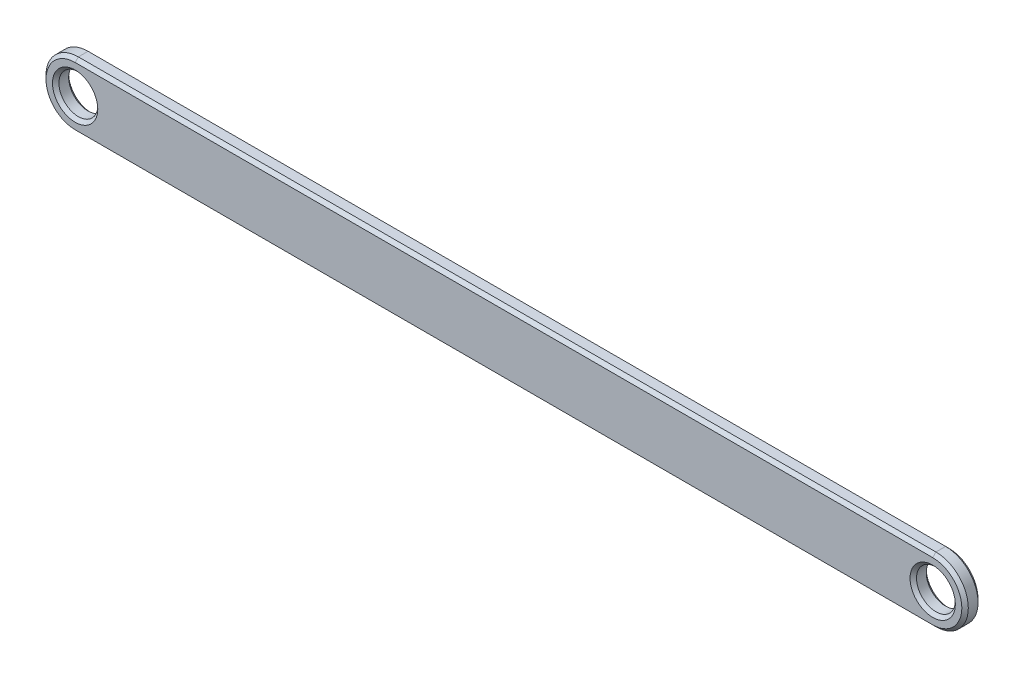
ISO-10303-21;
HEADER;
FILE_DESCRIPTION(('STEP AP214'),'2;1');
FILE_NAME('part.step','',(''),(''),'','','');
FILE_SCHEMA(('AUTOMOTIVE_DESIGN { 1 0 10303 214 1 1 1 1 }'));
ENDSEC;
DATA;
#1=APPLICATION_CONTEXT('core data for automotive mechanical design processes');
#2=APPLICATION_PROTOCOL_DEFINITION('international standard','automotive_design',2000,#1);
#3=PRODUCT_CONTEXT('',#1,'mechanical');
#4=PRODUCT('Part','Part','',(#3));
#5=PRODUCT_RELATED_PRODUCT_CATEGORY('part','',(#4));
#6=PRODUCT_DEFINITION_FORMATION('','',#4);
#7=PRODUCT_DEFINITION_CONTEXT('part definition',#1,'design');
#8=PRODUCT_DEFINITION('design','',#6,#7);
#9=PRODUCT_DEFINITION_SHAPE('','',#8);
#10=(LENGTH_UNIT() NAMED_UNIT(*) SI_UNIT(.MILLI.,.METRE.));
#11=(NAMED_UNIT(*) PLANE_ANGLE_UNIT() SI_UNIT($,.RADIAN.));
#12=(NAMED_UNIT(*) SI_UNIT($,.STERADIAN.) SOLID_ANGLE_UNIT());
#13=UNCERTAINTY_MEASURE_WITH_UNIT(LENGTH_MEASURE(1.E-05),#10,'distance_accuracy_value','');
#14=(GEOMETRIC_REPRESENTATION_CONTEXT(3) GLOBAL_UNCERTAINTY_ASSIGNED_CONTEXT((#13)) GLOBAL_UNIT_ASSIGNED_CONTEXT((#10,
#11,#12)) REPRESENTATION_CONTEXT('',''));
#15=CARTESIAN_POINT('',(0.,0.,0.));
#16=DIRECTION('',(0.,0.,1.));
#17=DIRECTION('',(1.,0.,0.));
#18=AXIS2_PLACEMENT_3D('',#15,#16,#17);
#19=CARTESIAN_POINT('',(-662.5,0.,25.));
#20=DIRECTION('',(0.,0.,1.));
#21=DIRECTION('',(1.,0.,0.));
#22=AXIS2_PLACEMENT_3D('',#19,#20,#21);
#23=PLANE('',#22);
#24=CARTESIAN_POINT('',(662.5,1.62265700887024E-13,25.));
#25=DIRECTION('',(0.,0.,1.));
#26=DIRECTION('',(1.,0.,0.));
#27=AXIS2_PLACEMENT_3D('',#24,#25,#26);
#28=CIRCLE('',#27,35.0000000000001);
#29=CARTESIAN_POINT('',(697.5,1.62265700887024E-13,25.));
#30=VERTEX_POINT('',#29);
#31=EDGE_CURVE('E11',#30,#30,#28,.F.);
#32=ORIENTED_EDGE('',*,*,#31,.T.);
#33=EDGE_LOOP('',(#32));
#34=FACE_BOUND('',#33,.T.);
#35=CARTESIAN_POINT('',(662.5,1.62265700887024E-13,25.));
#36=DIRECTION('',(0.,0.,1.));
#37=DIRECTION('',(1.,0.,0.));
#38=AXIS2_PLACEMENT_3D('',#35,#36,#37);
#39=CIRCLE('',#38,45.0000000000001);
#40=CARTESIAN_POINT('',(662.5,-44.9999999999999,25.));
#41=VERTEX_POINT('',#40);
#42=CARTESIAN_POINT('',(662.5,45.0000000000003,25.));
#43=VERTEX_POINT('',#42);
#44=EDGE_CURVE('E57',#41,#43,#39,.T.);
#45=ORIENTED_EDGE('',*,*,#44,.T.);
#46=DIRECTION('',(-1.,0.,0.));
#47=VECTOR('',#46,1.);
#48=CARTESIAN_POINT('',(-662.5,45.0000000000001,25.));
#49=LINE('',#48,#47);
#50=CARTESIAN_POINT('',(-662.5,45.0000000000001,25.));
#51=VERTEX_POINT('',#50);
#52=EDGE_CURVE('E49',#43,#51,#49,.T.);
#53=ORIENTED_EDGE('',*,*,#52,.T.);
#54=CARTESIAN_POINT('',(-662.5,0.,25.));
#55=DIRECTION('',(0.,0.,1.));
#56=DIRECTION('',(1.,0.,0.));
#57=AXIS2_PLACEMENT_3D('',#54,#55,#56);
#58=CIRCLE('',#57,45.0000000000001);
#59=CARTESIAN_POINT('',(-662.5,-45.0000000000001,25.));
#60=VERTEX_POINT('',#59);
#61=EDGE_CURVE('E194',#51,#60,#58,.T.);
#62=ORIENTED_EDGE('',*,*,#61,.T.);
#63=DIRECTION('',(1.,0.,0.));
#64=VECTOR('',#63,1.);
#65=CARTESIAN_POINT('',(662.5,-44.9999999999999,25.));
#66=LINE('',#65,#64);
#67=EDGE_CURVE('E62',#60,#41,#66,.T.);
#68=ORIENTED_EDGE('',*,*,#67,.T.);
#69=EDGE_LOOP('',(#45,#53,#62,#68));
#70=FACE_BOUND('',#69,.T.);
#71=CARTESIAN_POINT('',(-662.5,0.,25.));
#72=DIRECTION('',(0.,0.,1.));
#73=DIRECTION('',(1.,0.,0.));
#74=AXIS2_PLACEMENT_3D('',#71,#72,#73);
#75=CIRCLE('',#74,35.0000000000001);
#76=CARTESIAN_POINT('',(-627.5,0.,25.));
#77=VERTEX_POINT('',#76);
#78=EDGE_CURVE('E190',#77,#77,#75,.F.);
#79=ORIENTED_EDGE('',*,*,#78,.T.);
#80=EDGE_LOOP('',(#79));
#81=FACE_BOUND('',#80,.T.);
#82=ADVANCED_FACE('F39',(#34,#70,#81),#23,.T.);
#83=CARTESIAN_POINT('',(-662.5,0.,0.));
#84=DIRECTION('',(0.,0.,1.));
#85=DIRECTION('',(1.,0.,0.));
#86=AXIS2_PLACEMENT_3D('',#83,#84,#85);
#87=PLANE('',#86);
#88=CARTESIAN_POINT('',(662.5,1.62265700887024E-13,0.));
#89=DIRECTION('',(0.,0.,1.));
#90=DIRECTION('',(1.,0.,0.));
#91=AXIS2_PLACEMENT_3D('',#88,#89,#90);
#92=CIRCLE('',#91,34.9999999999999);
#93=CARTESIAN_POINT('',(697.5,1.62265700887024E-13,0.));
#94=VERTEX_POINT('',#93);
#95=EDGE_CURVE('E142',#94,#94,#92,.T.);
#96=ORIENTED_EDGE('',*,*,#95,.T.);
#97=EDGE_LOOP('',(#96));
#98=FACE_BOUND('',#97,.T.);
#99=CARTESIAN_POINT('',(-662.5,0.,0.));
#100=DIRECTION('',(0.,0.,1.));
#101=DIRECTION('',(1.,0.,0.));
#102=AXIS2_PLACEMENT_3D('',#99,#100,#101);
#103=CIRCLE('',#102,34.9999999999999);
#104=CARTESIAN_POINT('',(-627.5,0.,0.));
#105=VERTEX_POINT('',#104);
#106=EDGE_CURVE('E137',#105,#105,#103,.T.);
#107=ORIENTED_EDGE('',*,*,#106,.T.);
#108=EDGE_LOOP('',(#107));
#109=FACE_BOUND('',#108,.T.);
#110=CARTESIAN_POINT('',(662.5,1.62265700887024E-13,0.));
#111=DIRECTION('',(0.,0.,1.));
#112=DIRECTION('',(1.,0.,0.));
#113=AXIS2_PLACEMENT_3D('',#110,#111,#112);
#114=CIRCLE('',#113,45.0000000000001);
#115=CARTESIAN_POINT('',(662.5,45.0000000000003,0.));
#116=VERTEX_POINT('',#115);
#117=CARTESIAN_POINT('',(662.5,-45.,0.));
#118=VERTEX_POINT('',#117);
#119=EDGE_CURVE('E135',#116,#118,#114,.F.);
#120=ORIENTED_EDGE('',*,*,#119,.T.);
#121=DIRECTION('',(-1.,0.,0.));
#122=VECTOR('',#121,1.);
#123=CARTESIAN_POINT('',(-662.5,-45.0000000000001,0.));
#124=LINE('',#123,#122);
#125=CARTESIAN_POINT('',(-662.5,-45.0000000000001,0.));
#126=VERTEX_POINT('',#125);
#127=EDGE_CURVE('E112',#118,#126,#124,.T.);
#128=ORIENTED_EDGE('',*,*,#127,.T.);
#129=CARTESIAN_POINT('',(-662.5,0.,0.));
#130=DIRECTION('',(0.,0.,1.));
#131=DIRECTION('',(1.,0.,0.));
#132=AXIS2_PLACEMENT_3D('',#129,#130,#131);
#133=CIRCLE('',#132,45.0000000000001);
#134=CARTESIAN_POINT('',(-662.5,45.0000000000001,0.));
#135=VERTEX_POINT('',#134);
#136=EDGE_CURVE('E123',#126,#135,#133,.F.);
#137=ORIENTED_EDGE('',*,*,#136,.T.);
#138=DIRECTION('',(1.,0.,0.));
#139=VECTOR('',#138,1.);
#140=CARTESIAN_POINT('',(-662.5,45.0000000000001,0.));
#141=LINE('',#140,#139);
#142=EDGE_CURVE('E130',#135,#116,#141,.T.);
#143=ORIENTED_EDGE('',*,*,#142,.T.);
#144=EDGE_LOOP('',(#120,#128,#137,#143));
#145=FACE_BOUND('',#144,.T.);
#146=ADVANCED_FACE('F133',(#98,#109,#145),#87,.F.);
#147=CARTESIAN_POINT('',(-662.5,0.,25.));
#148=DIRECTION('',(0.,0.,-1.));
#149=DIRECTION('',(-1.,0.,0.));
#150=AXIS2_PLACEMENT_3D('',#147,#148,#149);
#151=CYLINDRICAL_SURFACE('',#150,50.);
#152=DIRECTION('',(0.,0.,-1.));
#153=VECTOR('',#152,1.);
#154=CARTESIAN_POINT('',(-662.5,50.,25.));
#155=LINE('',#154,#153);
#156=CARTESIAN_POINT('',(-662.5,50.,20.0000000000003));
#157=VERTEX_POINT('',#156);
#158=CARTESIAN_POINT('',(-662.5,50.,4.9999999999999));
#159=VERTEX_POINT('',#158);
#160=EDGE_CURVE('E210',#157,#159,#155,.T.);
#161=ORIENTED_EDGE('',*,*,#160,.T.);
#162=CARTESIAN_POINT('',(-662.5,0.,4.9999999999999));
#163=DIRECTION('',(0.,0.,1.));
#164=DIRECTION('',(1.,0.,0.));
#165=AXIS2_PLACEMENT_3D('',#162,#163,#164);
#166=CIRCLE('',#165,50.);
#167=CARTESIAN_POINT('',(-662.5,-50.,4.9999999999999));
#168=VERTEX_POINT('',#167);
#169=EDGE_CURVE('E187',#159,#168,#166,.T.);
#170=ORIENTED_EDGE('',*,*,#169,.T.);
#171=DIRECTION('',(0.,0.,-1.));
#172=VECTOR('',#171,1.);
#173=CARTESIAN_POINT('',(-662.5,-50.,25.));
#174=LINE('',#173,#172);
#175=CARTESIAN_POINT('',(-662.5,-50.,20.0000000000003));
#176=VERTEX_POINT('',#175);
#177=EDGE_CURVE('E131',#176,#168,#174,.T.);
#178=ORIENTED_EDGE('',*,*,#177,.F.);
#179=CARTESIAN_POINT('',(-662.5,0.,20.0000000000003));
#180=DIRECTION('',(0.,0.,1.));
#181=DIRECTION('',(1.,0.,0.));
#182=AXIS2_PLACEMENT_3D('',#179,#180,#181);
#183=CIRCLE('',#182,50.);
#184=EDGE_CURVE('E184',#176,#157,#183,.F.);
#185=ORIENTED_EDGE('',*,*,#184,.T.);
#186=EDGE_LOOP('',(#161,#170,#178,#185));
#187=FACE_BOUND('',#186,.T.);
#188=ADVANCED_FACE('F240',(#187),#151,.T.);
#189=CARTESIAN_POINT('',(662.5,-49.9999999999998,25.));
#190=DIRECTION('',(0.,1.,0.));
#191=DIRECTION('',(-1.,0.,0.));
#192=AXIS2_PLACEMENT_3D('',#189,#190,#191);
#193=PLANE('',#192);
#194=ORIENTED_EDGE('',*,*,#177,.T.);
#195=DIRECTION('',(1.,0.,0.));
#196=VECTOR('',#195,1.);
#197=CARTESIAN_POINT('',(662.5,-49.9999999999998,4.9999999999999));
#198=LINE('',#197,#196);
#199=CARTESIAN_POINT('',(662.5,-49.9999999999998,4.9999999999999));
#200=VERTEX_POINT('',#199);
#201=EDGE_CURVE('E115',#168,#200,#198,.T.);
#202=ORIENTED_EDGE('',*,*,#201,.T.);
#203=DIRECTION('',(0.,0.,-1.));
#204=VECTOR('',#203,1.);
#205=CARTESIAN_POINT('',(662.5,-49.9999999999998,25.));
#206=LINE('',#205,#204);
#207=CARTESIAN_POINT('',(662.5,-49.9999999999998,20.0000000000003));
#208=VERTEX_POINT('',#207);
#209=EDGE_CURVE('E237',#208,#200,#206,.T.);
#210=ORIENTED_EDGE('',*,*,#209,.F.);
#211=DIRECTION('',(-1.,0.,0.));
#212=VECTOR('',#211,1.);
#213=CARTESIAN_POINT('',(-662.5,-50.,20.0000000000003));
#214=LINE('',#213,#212);
#215=EDGE_CURVE('E166',#208,#176,#214,.T.);
#216=ORIENTED_EDGE('',*,*,#215,.T.);
#217=EDGE_LOOP('',(#194,#202,#210,#216));
#218=FACE_BOUND('',#217,.T.);
#219=ADVANCED_FACE('F235',(#218),#193,.F.);
#220=CARTESIAN_POINT('',(662.5,1.62265700887024E-13,25.));
#221=DIRECTION('',(0.,0.,-1.));
#222=DIRECTION('',(-1.,0.,0.));
#223=AXIS2_PLACEMENT_3D('',#220,#221,#222);
#224=CYLINDRICAL_SURFACE('',#223,50.);
#225=ORIENTED_EDGE('',*,*,#209,.T.);
#226=CARTESIAN_POINT('',(662.5,1.62265700887024E-13,4.9999999999999));
#227=DIRECTION('',(0.,0.,1.));
#228=DIRECTION('',(1.,0.,0.));
#229=AXIS2_PLACEMENT_3D('',#226,#227,#228);
#230=CIRCLE('',#229,50.);
#231=CARTESIAN_POINT('',(662.5,50.0000000000002,4.9999999999999));
#232=VERTEX_POINT('',#231);
#233=EDGE_CURVE('E174',#200,#232,#230,.T.);
#234=ORIENTED_EDGE('',*,*,#233,.T.);
#235=DIRECTION('',(0.,0.,-1.));
#236=VECTOR('',#235,1.);
#237=CARTESIAN_POINT('',(662.5,50.0000000000002,25.));
#238=LINE('',#237,#236);
#239=CARTESIAN_POINT('',(662.5,50.0000000000002,20.0000000000003));
#240=VERTEX_POINT('',#239);
#241=EDGE_CURVE('E245',#240,#232,#238,.T.);
#242=ORIENTED_EDGE('',*,*,#241,.F.);
#243=CARTESIAN_POINT('',(662.5,1.62265700887024E-13,20.0000000000003));
#244=DIRECTION('',(0.,0.,1.));
#245=DIRECTION('',(1.,0.,0.));
#246=AXIS2_PLACEMENT_3D('',#243,#244,#245);
#247=CIRCLE('',#246,50.);
#248=EDGE_CURVE('E171',#240,#208,#247,.F.);
#249=ORIENTED_EDGE('',*,*,#248,.T.);
#250=EDGE_LOOP('',(#225,#234,#242,#249));
#251=FACE_BOUND('',#250,.T.);
#252=ADVANCED_FACE('F259',(#251),#224,.T.);
#253=CARTESIAN_POINT('',(662.5,50.0000000000002,25.));
#254=DIRECTION('',(0.,-1.,0.));
#255=DIRECTION('',(1.,0.,0.));
#256=AXIS2_PLACEMENT_3D('',#253,#254,#255);
#257=PLANE('',#256);
#258=ORIENTED_EDGE('',*,*,#241,.T.);
#259=DIRECTION('',(-1.,0.,0.));
#260=VECTOR('',#259,1.);
#261=CARTESIAN_POINT('',(662.5,50.0000000000002,4.9999999999999));
#262=LINE('',#261,#260);
#263=EDGE_CURVE('E181',#232,#159,#262,.T.);
#264=ORIENTED_EDGE('',*,*,#263,.T.);
#265=ORIENTED_EDGE('',*,*,#160,.F.);
#266=DIRECTION('',(1.,0.,0.));
#267=VECTOR('',#266,1.);
#268=CARTESIAN_POINT('',(662.5,50.0000000000002,20.0000000000003));
#269=LINE('',#268,#267);
#270=EDGE_CURVE('E177',#157,#240,#269,.T.);
#271=ORIENTED_EDGE('',*,*,#270,.T.);
#272=EDGE_LOOP('',(#258,#264,#265,#271));
#273=FACE_BOUND('',#272,.T.);
#274=ADVANCED_FACE('F265',(#273),#257,.F.);
#275=CARTESIAN_POINT('',(-662.5,0.,25.));
#276=DIRECTION('',(0.,0.,-1.));
#277=DIRECTION('',(-1.,0.,0.));
#278=AXIS2_PLACEMENT_3D('',#275,#276,#277);
#279=CYLINDRICAL_SURFACE('',#278,30.);
#280=CARTESIAN_POINT('',(-662.5,0.,4.99999999999986));
#281=DIRECTION('',(0.,0.,1.));
#282=DIRECTION('',(1.,0.,0.));
#283=AXIS2_PLACEMENT_3D('',#280,#281,#282);
#284=CIRCLE('',#283,30.);
#285=CARTESIAN_POINT('',(-632.5,0.,4.99999999999986));
#286=VERTEX_POINT('',#285);
#287=EDGE_CURVE('E162',#286,#286,#284,.F.);
#288=ORIENTED_EDGE('',*,*,#287,.T.);
#289=EDGE_LOOP('',(#288));
#290=FACE_BOUND('',#289,.T.);
#291=CARTESIAN_POINT('',(-662.5,0.,19.9999999999998));
#292=DIRECTION('',(0.,0.,1.));
#293=DIRECTION('',(1.,0.,0.));
#294=AXIS2_PLACEMENT_3D('',#291,#292,#293);
#295=CIRCLE('',#294,30.);
#296=CARTESIAN_POINT('',(-632.5,0.,19.9999999999998));
#297=VERTEX_POINT('',#296);
#298=EDGE_CURVE('E158',#297,#297,#295,.T.);
#299=ORIENTED_EDGE('',*,*,#298,.T.);
#300=EDGE_LOOP('',(#299));
#301=FACE_BOUND('',#300,.T.);
#302=ADVANCED_FACE('F281',(#290,#301),#279,.F.);
#303=CARTESIAN_POINT('',(662.5,1.62265700887024E-13,25.));
#304=DIRECTION('',(0.,0.,-1.));
#305=DIRECTION('',(-1.,0.,0.));
#306=AXIS2_PLACEMENT_3D('',#303,#304,#305);
#307=CYLINDRICAL_SURFACE('',#306,30.);
#308=CARTESIAN_POINT('',(662.5,1.62265700887024E-13,4.99999999999986));
#309=DIRECTION('',(0.,0.,1.));
#310=DIRECTION('',(1.,0.,0.));
#311=AXIS2_PLACEMENT_3D('',#308,#309,#310);
#312=CIRCLE('',#311,30.);
#313=CARTESIAN_POINT('',(692.5,1.62265700887024E-13,4.99999999999986));
#314=VERTEX_POINT('',#313);
#315=EDGE_CURVE('E154',#314,#314,#312,.F.);
#316=ORIENTED_EDGE('',*,*,#315,.T.);
#317=EDGE_LOOP('',(#316));
#318=FACE_BOUND('',#317,.T.);
#319=CARTESIAN_POINT('',(662.5,1.62265700887024E-13,19.9999999999998));
#320=DIRECTION('',(0.,0.,1.));
#321=DIRECTION('',(1.,0.,0.));
#322=AXIS2_PLACEMENT_3D('',#319,#320,#321);
#323=CIRCLE('',#322,30.);
#324=CARTESIAN_POINT('',(692.5,1.62265700887024E-13,19.9999999999998));
#325=VERTEX_POINT('',#324);
#326=EDGE_CURVE('E150',#325,#325,#323,.T.);
#327=ORIENTED_EDGE('',*,*,#326,.T.);
#328=EDGE_LOOP('',(#327));
#329=FACE_BOUND('',#328,.T.);
#330=ADVANCED_FACE('F283',(#318,#329),#307,.F.);
#331=CARTESIAN_POINT('',(662.5,1.62265700887024E-13,0.));
#332=DIRECTION('',(0.,0.,-1.));
#333=DIRECTION('',(-1.,0.,0.));
#334=AXIS2_PLACEMENT_3D('',#331,#332,#333);
#335=CONICAL_SURFACE('',#334,34.9999999999999,0.785398163397449);
#336=ORIENTED_EDGE('',*,*,#315,.F.);
#337=EDGE_LOOP('',(#336));
#338=FACE_BOUND('',#337,.T.);
#339=ORIENTED_EDGE('',*,*,#95,.F.);
#340=EDGE_LOOP('',(#339));
#341=FACE_BOUND('',#340,.T.);
#342=ADVANCED_FACE('F290',(#338,#341),#335,.F.);
#343=CARTESIAN_POINT('',(-662.5,0.,0.));
#344=DIRECTION('',(0.,0.,-1.));
#345=DIRECTION('',(-1.,0.,0.));
#346=AXIS2_PLACEMENT_3D('',#343,#344,#345);
#347=CONICAL_SURFACE('',#346,34.9999999999999,0.785398163397449);
#348=ORIENTED_EDGE('',*,*,#287,.F.);
#349=EDGE_LOOP('',(#348));
#350=FACE_BOUND('',#349,.T.);
#351=ORIENTED_EDGE('',*,*,#106,.F.);
#352=EDGE_LOOP('',(#351));
#353=FACE_BOUND('',#352,.T.);
#354=ADVANCED_FACE('F306',(#350,#353),#347,.F.);
#355=CARTESIAN_POINT('',(662.5,50.0000000000002,4.9999999999999));
#356=DIRECTION('',(0.,-0.707106781186548,0.707106781186547));
#357=DIRECTION('',(-1.,0.,0.));
#358=AXIS2_PLACEMENT_3D('',#355,#356,#357);
#359=PLANE('',#358);
#360=DIRECTION('',(0.,0.707106781186547,0.707106781186548));
#361=VECTOR('',#360,1.);
#362=CARTESIAN_POINT('',(662.5,45.0000000000003,0.));
#363=LINE('',#362,#361);
#364=EDGE_CURVE('E119',#116,#232,#363,.T.);
#365=ORIENTED_EDGE('',*,*,#364,.F.);
#366=ORIENTED_EDGE('',*,*,#142,.F.);
#367=DIRECTION('',(0.,-0.707106781186547,-0.707106781186548));
#368=VECTOR('',#367,1.);
#369=CARTESIAN_POINT('',(-662.5,50.,4.9999999999999));
#370=LINE('',#369,#368);
#371=EDGE_CURVE('E126',#159,#135,#370,.T.);
#372=ORIENTED_EDGE('',*,*,#371,.F.);
#373=ORIENTED_EDGE('',*,*,#263,.F.);
#374=EDGE_LOOP('',(#365,#366,#372,#373));
#375=FACE_BOUND('',#374,.T.);
#376=ADVANCED_FACE('F252',(#375),#359,.F.);
#377=CARTESIAN_POINT('',(-662.5,0.,4.9999999999999));
#378=DIRECTION('',(0.,0.,1.));
#379=DIRECTION('',(1.,0.,0.));
#380=AXIS2_PLACEMENT_3D('',#377,#378,#379);
#381=CONICAL_SURFACE('',#380,50.,0.785398163397448);
#382=ORIENTED_EDGE('',*,*,#371,.T.);
#383=ORIENTED_EDGE('',*,*,#136,.F.);
#384=DIRECTION('',(0.,0.707106781186547,-0.707106781186548));
#385=VECTOR('',#384,1.);
#386=CARTESIAN_POINT('',(-662.5,-50.,4.9999999999999));
#387=LINE('',#386,#385);
#388=EDGE_CURVE('E108',#168,#126,#387,.T.);
#389=ORIENTED_EDGE('',*,*,#388,.F.);
#390=ORIENTED_EDGE('',*,*,#169,.F.);
#391=EDGE_LOOP('',(#382,#383,#389,#390));
#392=FACE_BOUND('',#391,.T.);
#393=ADVANCED_FACE('F124',(#392),#381,.T.);
#394=CARTESIAN_POINT('',(662.5,1.62265700887024E-13,4.9999999999999));
#395=DIRECTION('',(0.,0.,1.));
#396=DIRECTION('',(1.,0.,0.));
#397=AXIS2_PLACEMENT_3D('',#394,#395,#396);
#398=CONICAL_SURFACE('',#397,50.,0.785398163397448);
#399=ORIENTED_EDGE('',*,*,#364,.T.);
#400=ORIENTED_EDGE('',*,*,#233,.F.);
#401=DIRECTION('',(0.,-0.707106781186547,0.707106781186548));
#402=VECTOR('',#401,1.);
#403=CARTESIAN_POINT('',(662.5,-45.,0.));
#404=LINE('',#403,#402);
#405=EDGE_CURVE('E120',#118,#200,#404,.T.);
#406=ORIENTED_EDGE('',*,*,#405,.F.);
#407=ORIENTED_EDGE('',*,*,#119,.F.);
#408=EDGE_LOOP('',(#399,#400,#406,#407));
#409=FACE_BOUND('',#408,.T.);
#410=ADVANCED_FACE('F255',(#409),#398,.T.);
#411=CARTESIAN_POINT('',(662.5,-49.9999999999998,4.9999999999999));
#412=DIRECTION('',(0.,0.707106781186548,0.707106781186547));
#413=DIRECTION('',(1.,0.,0.));
#414=AXIS2_PLACEMENT_3D('',#411,#412,#413);
#415=PLANE('',#414);
#416=ORIENTED_EDGE('',*,*,#388,.T.);
#417=ORIENTED_EDGE('',*,*,#127,.F.);
#418=ORIENTED_EDGE('',*,*,#405,.T.);
#419=ORIENTED_EDGE('',*,*,#201,.F.);
#420=EDGE_LOOP('',(#416,#417,#418,#419));
#421=FACE_BOUND('',#420,.T.);
#422=ADVANCED_FACE('F110',(#421),#415,.F.);
#423=CARTESIAN_POINT('',(662.5,1.62265700887024E-13,19.9999999999998));
#424=DIRECTION('',(0.,0.,1.));
#425=DIRECTION('',(1.,0.,0.));
#426=AXIS2_PLACEMENT_3D('',#423,#424,#425);
#427=CONICAL_SURFACE('',#426,30.,0.785398163397438);
#428=ORIENTED_EDGE('',*,*,#31,.F.);
#429=EDGE_LOOP('',(#428));
#430=FACE_BOUND('',#429,.T.);
#431=ORIENTED_EDGE('',*,*,#326,.F.);
#432=EDGE_LOOP('',(#431));
#433=FACE_BOUND('',#432,.T.);
#434=ADVANCED_FACE('F313',(#430,#433),#427,.F.);
#435=CARTESIAN_POINT('',(-662.5,-45.0000000000001,25.));
#436=DIRECTION('',(0.,-0.707106781186532,0.707106781186563));
#437=DIRECTION('',(-1.,0.,0.));
#438=AXIS2_PLACEMENT_3D('',#435,#436,#437);
#439=PLANE('',#438);
#440=DIRECTION('',(0.,0.707106781186563,0.707106781186532));
#441=VECTOR('',#440,1.);
#442=CARTESIAN_POINT('',(-662.5,-50.,20.0000000000003));
#443=LINE('',#442,#441);
#444=EDGE_CURVE('E216',#176,#60,#443,.T.);
#445=ORIENTED_EDGE('',*,*,#444,.F.);
#446=ORIENTED_EDGE('',*,*,#215,.F.);
#447=DIRECTION('',(0.,-0.707106781186563,-0.707106781186532));
#448=VECTOR('',#447,1.);
#449=CARTESIAN_POINT('',(662.5,-44.9999999999999,25.));
#450=LINE('',#449,#448);
#451=EDGE_CURVE('E43',#41,#208,#450,.T.);
#452=ORIENTED_EDGE('',*,*,#451,.F.);
#453=ORIENTED_EDGE('',*,*,#67,.F.);
#454=EDGE_LOOP('',(#445,#446,#452,#453));
#455=FACE_BOUND('',#454,.T.);
#456=ADVANCED_FACE('F230',(#455),#439,.T.);
#457=CARTESIAN_POINT('',(662.5,1.62265700887024E-13,25.));
#458=DIRECTION('',(0.,0.,-1.));
#459=DIRECTION('',(-1.,0.,0.));
#460=AXIS2_PLACEMENT_3D('',#457,#458,#459);
#461=CONICAL_SURFACE('',#460,45.0000000000001,0.78539816339747);
#462=ORIENTED_EDGE('',*,*,#451,.T.);
#463=ORIENTED_EDGE('',*,*,#248,.F.);
#464=DIRECTION('',(0.,0.707106781186563,-0.707106781186532));
#465=VECTOR('',#464,1.);
#466=CARTESIAN_POINT('',(662.5,45.0000000000003,25.));
#467=LINE('',#466,#465);
#468=EDGE_CURVE('E214',#43,#240,#467,.T.);
#469=ORIENTED_EDGE('',*,*,#468,.F.);
#470=ORIENTED_EDGE('',*,*,#44,.F.);
#471=EDGE_LOOP('',(#462,#463,#469,#470));
#472=FACE_BOUND('',#471,.T.);
#473=ADVANCED_FACE('F227',(#472),#461,.T.);
#474=CARTESIAN_POINT('',(-662.5,0.,25.));
#475=DIRECTION('',(0.,0.,-1.));
#476=DIRECTION('',(-1.,0.,0.));
#477=AXIS2_PLACEMENT_3D('',#474,#475,#476);
#478=CONICAL_SURFACE('',#477,45.0000000000001,0.78539816339747);
#479=ORIENTED_EDGE('',*,*,#444,.T.);
#480=ORIENTED_EDGE('',*,*,#61,.F.);
#481=DIRECTION('',(0.,-0.707106781186563,0.707106781186532));
#482=VECTOR('',#481,1.);
#483=CARTESIAN_POINT('',(-662.5,50.,20.0000000000003));
#484=LINE('',#483,#482);
#485=EDGE_CURVE('E211',#157,#51,#484,.T.);
#486=ORIENTED_EDGE('',*,*,#485,.F.);
#487=ORIENTED_EDGE('',*,*,#184,.F.);
#488=EDGE_LOOP('',(#479,#480,#486,#487));
#489=FACE_BOUND('',#488,.T.);
#490=ADVANCED_FACE('F270',(#489),#478,.T.);
#491=CARTESIAN_POINT('',(-662.5,45.0000000000001,25.));
#492=DIRECTION('',(0.,0.707106781186532,0.707106781186563));
#493=DIRECTION('',(1.,0.,0.));
#494=AXIS2_PLACEMENT_3D('',#491,#492,#493);
#495=PLANE('',#494);
#496=ORIENTED_EDGE('',*,*,#468,.T.);
#497=ORIENTED_EDGE('',*,*,#270,.F.);
#498=ORIENTED_EDGE('',*,*,#485,.T.);
#499=ORIENTED_EDGE('',*,*,#52,.F.);
#500=EDGE_LOOP('',(#496,#497,#498,#499));
#501=FACE_BOUND('',#500,.T.);
#502=ADVANCED_FACE('F268',(#501),#495,.T.);
#503=CARTESIAN_POINT('',(-662.5,0.,19.9999999999998));
#504=DIRECTION('',(0.,0.,1.));
#505=DIRECTION('',(1.,0.,0.));
#506=AXIS2_PLACEMENT_3D('',#503,#504,#505);
#507=CONICAL_SURFACE('',#506,30.,0.785398163397438);
#508=ORIENTED_EDGE('',*,*,#78,.F.);
#509=EDGE_LOOP('',(#508));
#510=FACE_BOUND('',#509,.T.);
#511=ORIENTED_EDGE('',*,*,#298,.F.);
#512=EDGE_LOOP('',(#511));
#513=FACE_BOUND('',#512,.T.);
#514=ADVANCED_FACE('F41',(#510,#513),#507,.F.);
#515=CLOSED_SHELL('',(#82,#146,#188,#219,#252,#274,#302,#330,#342,#354,#376,#393,#410,#422,#434,
#456,#473,#490,#502,#514));
#516=MANIFOLD_SOLID_BREP('B2',#515);
#517=ADVANCED_BREP_SHAPE_REPRESENTATION('',(#18,#516),#14);
#518=SHAPE_DEFINITION_REPRESENTATION(#9,#517);
ENDSEC;
END-ISO-10303-21;
